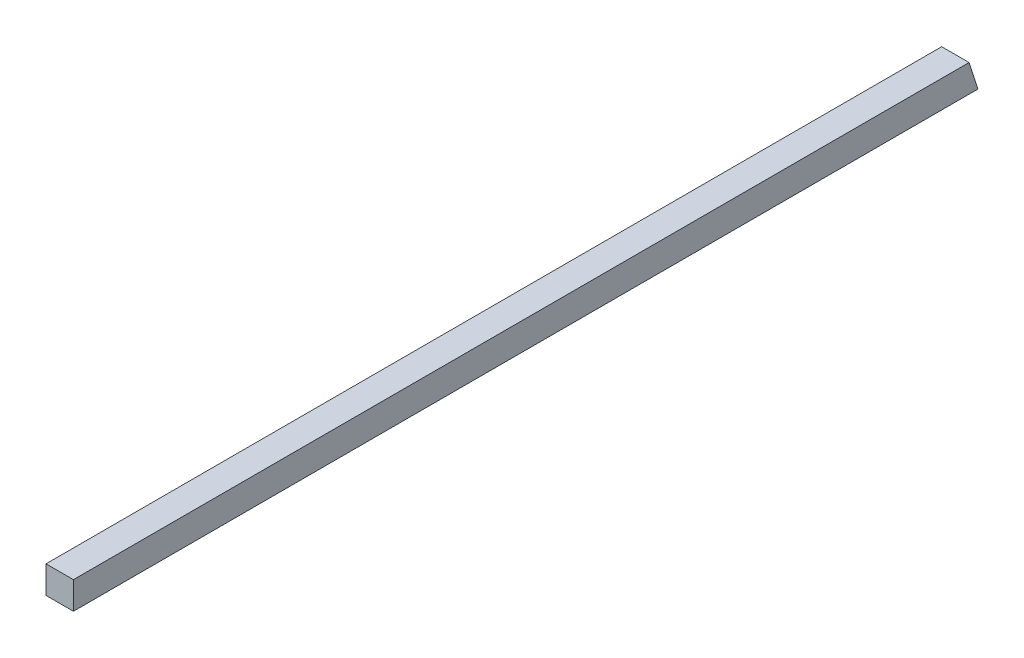
ISO-10303-21;
HEADER;
FILE_DESCRIPTION(('STEP AP214'),'2;1');
FILE_NAME('part.step','',(''),(''),'','','');
FILE_SCHEMA(('AUTOMOTIVE_DESIGN { 1 0 10303 214 1 1 1 1 }'));
ENDSEC;
DATA;
#1=APPLICATION_CONTEXT('core data for automotive mechanical design processes');
#2=APPLICATION_PROTOCOL_DEFINITION('international standard','automotive_design',2000,#1);
#3=PRODUCT_CONTEXT('',#1,'mechanical');
#4=PRODUCT('Part','Part','',(#3));
#5=PRODUCT_RELATED_PRODUCT_CATEGORY('part','',(#4));
#6=PRODUCT_DEFINITION_FORMATION('','',#4);
#7=PRODUCT_DEFINITION_CONTEXT('part definition',#1,'design');
#8=PRODUCT_DEFINITION('design','',#6,#7);
#9=PRODUCT_DEFINITION_SHAPE('','',#8);
#10=(LENGTH_UNIT() NAMED_UNIT(*) SI_UNIT(.MILLI.,.METRE.));
#11=(NAMED_UNIT(*) PLANE_ANGLE_UNIT() SI_UNIT($,.RADIAN.));
#12=(NAMED_UNIT(*) SI_UNIT($,.STERADIAN.) SOLID_ANGLE_UNIT());
#13=UNCERTAINTY_MEASURE_WITH_UNIT(LENGTH_MEASURE(1.E-05),#10,'distance_accuracy_value','');
#14=(GEOMETRIC_REPRESENTATION_CONTEXT(3) GLOBAL_UNCERTAINTY_ASSIGNED_CONTEXT((#13)) GLOBAL_UNIT_ASSIGNED_CONTEXT((#10,
#11,#12)) REPRESENTATION_CONTEXT('',''));
#15=CARTESIAN_POINT('',(0.,0.,0.));
#16=DIRECTION('',(0.,0.,1.));
#17=DIRECTION('',(1.,0.,0.));
#18=AXIS2_PLACEMENT_3D('',#15,#16,#17);
#19=CARTESIAN_POINT('',(31.75,31.75,0.));
#20=DIRECTION('',(0.,1.,0.));
#21=DIRECTION('',(0.,0.,1.));
#22=AXIS2_PLACEMENT_3D('',#19,#20,#21);
#23=PLANE('',#22);
#24=DIRECTION('',(1.,0.,0.));
#25=VECTOR('',#24,1.);
#26=CARTESIAN_POINT('',(0.,31.75,1047.75));
#27=LINE('',#26,#25);
#28=CARTESIAN_POINT('',(31.75,31.75,1047.75));
#29=VERTEX_POINT('',#28);
#30=CARTESIAN_POINT('',(0.,31.75,1047.75));
#31=VERTEX_POINT('',#30);
#32=EDGE_CURVE('E84',#29,#31,#27,.F.);
#33=ORIENTED_EDGE('',*,*,#32,.F.);
#34=DIRECTION('',(0.,0.,-1.));
#35=VECTOR('',#34,1.);
#36=CARTESIAN_POINT('',(31.75,31.75,0.));
#37=LINE('',#36,#35);
#38=CARTESIAN_POINT('',(31.75,31.75,10.3162003553939));
#39=VERTEX_POINT('',#38);
#40=EDGE_CURVE('E71',#39,#29,#37,.F.);
#41=ORIENTED_EDGE('',*,*,#40,.F.);
#42=DIRECTION('',(1.,0.,0.));
#43=VECTOR('',#42,1.);
#44=CARTESIAN_POINT('',(31.75,31.75,10.3162003553939));
#45=LINE('',#44,#43);
#46=CARTESIAN_POINT('',(0.,31.75,10.3162003553939));
#47=VERTEX_POINT('',#46);
#48=EDGE_CURVE('E36',#39,#47,#45,.F.);
#49=ORIENTED_EDGE('',*,*,#48,.T.);
#50=DIRECTION('',(0.,0.,1.));
#51=VECTOR('',#50,1.);
#52=CARTESIAN_POINT('',(0.,31.75,0.));
#53=LINE('',#52,#51);
#54=EDGE_CURVE('E97',#31,#47,#53,.F.);
#55=ORIENTED_EDGE('',*,*,#54,.F.);
#56=EDGE_LOOP('',(#33,#41,#49,#55));
#57=FACE_BOUND('',#56,.T.);
#58=ADVANCED_FACE('F33',(#57),#23,.T.);
#59=CARTESIAN_POINT('',(31.75,31.75,10.3162003553939));
#60=DIRECTION('',(0.,-0.309016994374891,0.951056516295172));
#61=DIRECTION('',(0.,-0.951056516295172,-0.309016994374891));
#62=AXIS2_PLACEMENT_3D('',#59,#60,#61);
#63=PLANE('',#62);
#64=ORIENTED_EDGE('',*,*,#48,.F.);
#65=DIRECTION('',(0.,0.951056516295168,0.309016994374903));
#66=VECTOR('',#65,1.);
#67=CARTESIAN_POINT('',(31.75,0.,7.94166764434948E-13));
#68=LINE('',#67,#66);
#69=CARTESIAN_POINT('',(31.75,0.,9.99032428381426E-13));
#70=VERTEX_POINT('',#69);
#71=EDGE_CURVE('E77',#70,#39,#68,.T.);
#72=ORIENTED_EDGE('',*,*,#71,.F.);
#73=DIRECTION('',(1.,0.,0.));
#74=VECTOR('',#73,1.);
#75=CARTESIAN_POINT('',(0.,0.,7.94166764434948E-13));
#76=LINE('',#75,#74);
#77=CARTESIAN_POINT('',(0.,0.,9.99550256141028E-13));
#78=VERTEX_POINT('',#77);
#79=EDGE_CURVE('E99',#78,#70,#76,.T.);
#80=ORIENTED_EDGE('',*,*,#79,.F.);
#81=DIRECTION('',(0.,-0.951056516295168,-0.309016994374903));
#82=VECTOR('',#81,1.);
#83=CARTESIAN_POINT('',(0.,31.75,10.3162003553939));
#84=LINE('',#83,#82);
#85=EDGE_CURVE('E80',#47,#78,#84,.T.);
#86=ORIENTED_EDGE('',*,*,#85,.F.);
#87=EDGE_LOOP('',(#64,#72,#80,#86));
#88=FACE_BOUND('',#87,.T.);
#89=ADVANCED_FACE('F76',(#88),#63,.F.);
#90=CARTESIAN_POINT('',(31.75,0.,0.));
#91=DIRECTION('',(1.,0.,0.));
#92=DIRECTION('',(0.,0.,-1.));
#93=AXIS2_PLACEMENT_3D('',#90,#91,#92);
#94=PLANE('',#93);
#95=DIRECTION('',(0.,1.,0.));
#96=VECTOR('',#95,1.);
#97=CARTESIAN_POINT('',(31.75,0.,1047.75));
#98=LINE('',#97,#96);
#99=CARTESIAN_POINT('',(31.75,0.,1047.75));
#100=VERTEX_POINT('',#99);
#101=EDGE_CURVE('E86',#100,#29,#98,.T.);
#102=ORIENTED_EDGE('',*,*,#101,.F.);
#103=DIRECTION('',(0.,0.,-1.));
#104=VECTOR('',#103,1.);
#105=CARTESIAN_POINT('',(31.75,0.,0.));
#106=LINE('',#105,#104);
#107=EDGE_CURVE('E90',#70,#100,#106,.F.);
#108=ORIENTED_EDGE('',*,*,#107,.F.);
#109=ORIENTED_EDGE('',*,*,#71,.T.);
#110=ORIENTED_EDGE('',*,*,#40,.T.);
#111=EDGE_LOOP('',(#102,#108,#109,#110));
#112=FACE_BOUND('',#111,.T.);
#113=ADVANCED_FACE('F88',(#112),#94,.T.);
#114=CARTESIAN_POINT('',(0.,0.,1047.75));
#115=DIRECTION('',(0.,0.,1.));
#116=DIRECTION('',(1.,0.,0.));
#117=AXIS2_PLACEMENT_3D('',#114,#115,#116);
#118=PLANE('',#117);
#119=ORIENTED_EDGE('',*,*,#32,.T.);
#120=DIRECTION('',(0.,1.,0.));
#121=VECTOR('',#120,1.);
#122=CARTESIAN_POINT('',(0.,31.75,1047.75));
#123=LINE('',#122,#121);
#124=CARTESIAN_POINT('',(0.,0.,1047.75));
#125=VERTEX_POINT('',#124);
#126=EDGE_CURVE('E51',#125,#31,#123,.T.);
#127=ORIENTED_EDGE('',*,*,#126,.F.);
#128=DIRECTION('',(1.,0.,0.));
#129=VECTOR('',#128,1.);
#130=CARTESIAN_POINT('',(0.,0.,1047.75));
#131=LINE('',#130,#129);
#132=EDGE_CURVE('E42',#100,#125,#131,.F.);
#133=ORIENTED_EDGE('',*,*,#132,.F.);
#134=ORIENTED_EDGE('',*,*,#101,.T.);
#135=EDGE_LOOP('',(#119,#127,#133,#134));
#136=FACE_BOUND('',#135,.T.);
#137=ADVANCED_FACE('F105',(#136),#118,.T.);
#138=CARTESIAN_POINT('',(0.,31.75,0.));
#139=DIRECTION('',(-1.,0.,0.));
#140=DIRECTION('',(0.,0.,1.));
#141=AXIS2_PLACEMENT_3D('',#138,#139,#140);
#142=PLANE('',#141);
#143=ORIENTED_EDGE('',*,*,#126,.T.);
#144=ORIENTED_EDGE('',*,*,#54,.T.);
#145=ORIENTED_EDGE('',*,*,#85,.T.);
#146=DIRECTION('',(0.,0.,-1.));
#147=VECTOR('',#146,1.);
#148=CARTESIAN_POINT('',(0.,0.,0.));
#149=LINE('',#148,#147);
#150=EDGE_CURVE('E11',#125,#78,#149,.T.);
#151=ORIENTED_EDGE('',*,*,#150,.F.);
#152=EDGE_LOOP('',(#143,#144,#145,#151));
#153=FACE_BOUND('',#152,.T.);
#154=ADVANCED_FACE('F107',(#153),#142,.T.);
#155=CARTESIAN_POINT('',(0.,0.,0.));
#156=DIRECTION('',(0.,-1.,0.));
#157=DIRECTION('',(0.,0.,-1.));
#158=AXIS2_PLACEMENT_3D('',#155,#156,#157);
#159=PLANE('',#158);
#160=ORIENTED_EDGE('',*,*,#132,.T.);
#161=ORIENTED_EDGE('',*,*,#150,.T.);
#162=ORIENTED_EDGE('',*,*,#79,.T.);
#163=ORIENTED_EDGE('',*,*,#107,.T.);
#164=EDGE_LOOP('',(#160,#161,#162,#163));
#165=FACE_BOUND('',#164,.T.);
#166=ADVANCED_FACE('F104',(#165),#159,.T.);
#167=CLOSED_SHELL('',(#58,#89,#113,#137,#154,#166));
#168=MANIFOLD_SOLID_BREP('B2',#167);
#169=ADVANCED_BREP_SHAPE_REPRESENTATION('',(#18,#168),#14);
#170=SHAPE_DEFINITION_REPRESENTATION(#9,#169);
ENDSEC;
END-ISO-10303-21;
